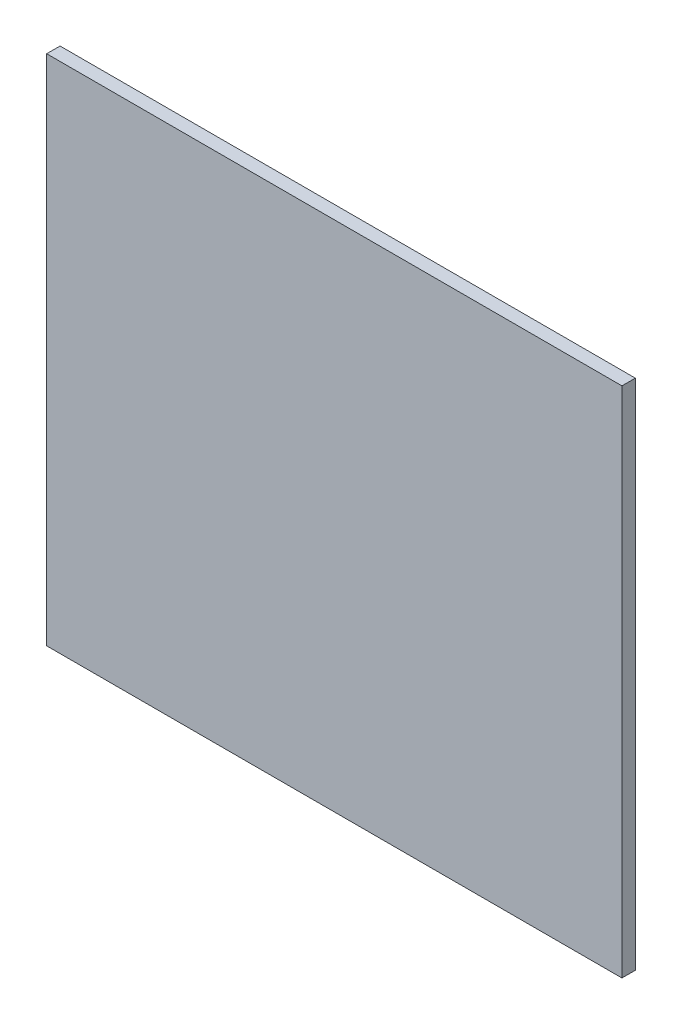
ISO-10303-21;
HEADER;
FILE_DESCRIPTION(('STEP AP214'),'2;1');
FILE_NAME('part.step','',(''),(''),'','','');
FILE_SCHEMA(('AUTOMOTIVE_DESIGN { 1 0 10303 214 1 1 1 1 }'));
ENDSEC;
DATA;
#1=APPLICATION_CONTEXT('core data for automotive mechanical design processes');
#2=APPLICATION_PROTOCOL_DEFINITION('international standard','automotive_design',2000,#1);
#3=PRODUCT_CONTEXT('',#1,'mechanical');
#4=PRODUCT('Part','Part','',(#3));
#5=PRODUCT_RELATED_PRODUCT_CATEGORY('part','',(#4));
#6=PRODUCT_DEFINITION_FORMATION('','',#4);
#7=PRODUCT_DEFINITION_CONTEXT('part definition',#1,'design');
#8=PRODUCT_DEFINITION('design','',#6,#7);
#9=PRODUCT_DEFINITION_SHAPE('','',#8);
#10=(LENGTH_UNIT() NAMED_UNIT(*) SI_UNIT(.MILLI.,.METRE.));
#11=(NAMED_UNIT(*) PLANE_ANGLE_UNIT() SI_UNIT($,.RADIAN.));
#12=(NAMED_UNIT(*) SI_UNIT($,.STERADIAN.) SOLID_ANGLE_UNIT());
#13=UNCERTAINTY_MEASURE_WITH_UNIT(LENGTH_MEASURE(1.E-05),#10,'distance_accuracy_value','');
#14=(GEOMETRIC_REPRESENTATION_CONTEXT(3) GLOBAL_UNCERTAINTY_ASSIGNED_CONTEXT((#13)) GLOBAL_UNIT_ASSIGNED_CONTEXT((#10,
#11,#12)) REPRESENTATION_CONTEXT('',''));
#15=CARTESIAN_POINT('',(0.,0.,0.));
#16=DIRECTION('',(0.,0.,1.));
#17=DIRECTION('',(1.,0.,0.));
#18=AXIS2_PLACEMENT_3D('',#15,#16,#17);
#19=CARTESIAN_POINT('',(-258.,0.,6.));
#20=DIRECTION('',(0.,1.,0.));
#21=DIRECTION('',(0.,0.,1.));
#22=AXIS2_PLACEMENT_3D('',#19,#20,#21);
#23=PLANE('',#22);
#24=DIRECTION('',(1.,0.,0.));
#25=VECTOR('',#24,1.);
#26=CARTESIAN_POINT('',(-258.,0.,0.));
#27=LINE('',#26,#25);
#28=CARTESIAN_POINT('',(-258.,0.,0.));
#29=VERTEX_POINT('',#28);
#30=CARTESIAN_POINT('',(0.,0.,0.));
#31=VERTEX_POINT('',#30);
#32=EDGE_CURVE('E96',#29,#31,#27,.T.);
#33=ORIENTED_EDGE('',*,*,#32,.T.);
#34=DIRECTION('',(0.,0.,-1.));
#35=VECTOR('',#34,1.);
#36=CARTESIAN_POINT('',(0.,0.,6.));
#37=LINE('',#36,#35);
#38=CARTESIAN_POINT('',(0.,0.,6.));
#39=VERTEX_POINT('',#38);
#40=EDGE_CURVE('E11',#39,#31,#37,.T.);
#41=ORIENTED_EDGE('',*,*,#40,.F.);
#42=DIRECTION('',(1.,0.,0.));
#43=VECTOR('',#42,1.);
#44=CARTESIAN_POINT('',(-258.,0.,6.));
#45=LINE('',#44,#43);
#46=CARTESIAN_POINT('',(-258.,0.,6.));
#47=VERTEX_POINT('',#46);
#48=EDGE_CURVE('E84',#47,#39,#45,.T.);
#49=ORIENTED_EDGE('',*,*,#48,.F.);
#50=DIRECTION('',(0.,0.,-1.));
#51=VECTOR('',#50,1.);
#52=CARTESIAN_POINT('',(-258.,0.,6.));
#53=LINE('',#52,#51);
#54=EDGE_CURVE('E92',#47,#29,#53,.T.);
#55=ORIENTED_EDGE('',*,*,#54,.T.);
#56=EDGE_LOOP('',(#33,#41,#49,#55));
#57=FACE_BOUND('',#56,.T.);
#58=ADVANCED_FACE('F33',(#57),#23,.F.);
#59=CARTESIAN_POINT('',(0.,0.,6.));
#60=DIRECTION('',(-1.,0.,0.));
#61=DIRECTION('',(0.,0.,1.));
#62=AXIS2_PLACEMENT_3D('',#59,#60,#61);
#63=PLANE('',#62);
#64=DIRECTION('',(0.,1.,0.));
#65=VECTOR('',#64,1.);
#66=CARTESIAN_POINT('',(0.,0.,0.));
#67=LINE('',#66,#65);
#68=CARTESIAN_POINT('',(0.,230.,0.));
#69=VERTEX_POINT('',#68);
#70=EDGE_CURVE('E88',#31,#69,#67,.T.);
#71=ORIENTED_EDGE('',*,*,#70,.T.);
#72=DIRECTION('',(0.,0.,-1.));
#73=VECTOR('',#72,1.);
#74=CARTESIAN_POINT('',(0.,230.,6.));
#75=LINE('',#74,#73);
#76=CARTESIAN_POINT('',(0.,230.,6.));
#77=VERTEX_POINT('',#76);
#78=EDGE_CURVE('E41',#77,#69,#75,.T.);
#79=ORIENTED_EDGE('',*,*,#78,.F.);
#80=DIRECTION('',(0.,1.,0.));
#81=VECTOR('',#80,1.);
#82=CARTESIAN_POINT('',(0.,0.,6.));
#83=LINE('',#82,#81);
#84=EDGE_CURVE('E79',#39,#77,#83,.T.);
#85=ORIENTED_EDGE('',*,*,#84,.F.);
#86=ORIENTED_EDGE('',*,*,#40,.T.);
#87=EDGE_LOOP('',(#71,#79,#85,#86));
#88=FACE_BOUND('',#87,.T.);
#89=ADVANCED_FACE('F87',(#88),#63,.F.);
#90=CARTESIAN_POINT('',(0.,230.,6.));
#91=DIRECTION('',(0.,-1.,0.));
#92=DIRECTION('',(0.,0.,-1.));
#93=AXIS2_PLACEMENT_3D('',#90,#91,#92);
#94=PLANE('',#93);
#95=DIRECTION('',(-1.,0.,0.));
#96=VECTOR('',#95,1.);
#97=CARTESIAN_POINT('',(0.,230.,0.));
#98=LINE('',#97,#96);
#99=CARTESIAN_POINT('',(-258.,230.,0.));
#100=VERTEX_POINT('',#99);
#101=EDGE_CURVE('E66',#69,#100,#98,.T.);
#102=ORIENTED_EDGE('',*,*,#101,.T.);
#103=DIRECTION('',(0.,0.,-1.));
#104=VECTOR('',#103,1.);
#105=CARTESIAN_POINT('',(-258.,230.,6.));
#106=LINE('',#105,#104);
#107=CARTESIAN_POINT('',(-258.,230.,6.));
#108=VERTEX_POINT('',#107);
#109=EDGE_CURVE('E89',#108,#100,#106,.T.);
#110=ORIENTED_EDGE('',*,*,#109,.F.);
#111=DIRECTION('',(-1.,0.,0.));
#112=VECTOR('',#111,1.);
#113=CARTESIAN_POINT('',(0.,230.,6.));
#114=LINE('',#113,#112);
#115=EDGE_CURVE('E82',#77,#108,#114,.T.);
#116=ORIENTED_EDGE('',*,*,#115,.F.);
#117=ORIENTED_EDGE('',*,*,#78,.T.);
#118=EDGE_LOOP('',(#102,#110,#116,#117));
#119=FACE_BOUND('',#118,.T.);
#120=ADVANCED_FACE('F90',(#119),#94,.F.);
#121=CARTESIAN_POINT('',(-258.,230.,6.));
#122=DIRECTION('',(1.,0.,0.));
#123=DIRECTION('',(0.,1.,0.));
#124=AXIS2_PLACEMENT_3D('',#121,#122,#123);
#125=PLANE('',#124);
#126=DIRECTION('',(0.,-1.,0.));
#127=VECTOR('',#126,1.);
#128=CARTESIAN_POINT('',(-258.,230.,0.));
#129=LINE('',#128,#127);
#130=EDGE_CURVE('E72',#100,#29,#129,.T.);
#131=ORIENTED_EDGE('',*,*,#130,.T.);
#132=ORIENTED_EDGE('',*,*,#54,.F.);
#133=DIRECTION('',(0.,-1.,0.));
#134=VECTOR('',#133,1.);
#135=CARTESIAN_POINT('',(-258.,230.,6.));
#136=LINE('',#135,#134);
#137=EDGE_CURVE('E49',#108,#47,#136,.T.);
#138=ORIENTED_EDGE('',*,*,#137,.F.);
#139=ORIENTED_EDGE('',*,*,#109,.T.);
#140=EDGE_LOOP('',(#131,#132,#138,#139));
#141=FACE_BOUND('',#140,.T.);
#142=ADVANCED_FACE('F103',(#141),#125,.F.);
#143=CARTESIAN_POINT('',(0.,0.,6.));
#144=DIRECTION('',(0.,0.,1.));
#145=DIRECTION('',(1.,0.,0.));
#146=AXIS2_PLACEMENT_3D('',#143,#144,#145);
#147=PLANE('',#146);
#148=ORIENTED_EDGE('',*,*,#48,.T.);
#149=ORIENTED_EDGE('',*,*,#84,.T.);
#150=ORIENTED_EDGE('',*,*,#115,.T.);
#151=ORIENTED_EDGE('',*,*,#137,.T.);
#152=EDGE_LOOP('',(#148,#149,#150,#151));
#153=FACE_BOUND('',#152,.T.);
#154=ADVANCED_FACE('F80',(#153),#147,.T.);
#155=CARTESIAN_POINT('',(0.,0.,0.));
#156=DIRECTION('',(0.,0.,1.));
#157=DIRECTION('',(1.,0.,0.));
#158=AXIS2_PLACEMENT_3D('',#155,#156,#157);
#159=PLANE('',#158);
#160=ORIENTED_EDGE('',*,*,#32,.F.);
#161=ORIENTED_EDGE('',*,*,#130,.F.);
#162=ORIENTED_EDGE('',*,*,#101,.F.);
#163=ORIENTED_EDGE('',*,*,#70,.F.);
#164=EDGE_LOOP('',(#160,#161,#162,#163));
#165=FACE_BOUND('',#164,.T.);
#166=ADVANCED_FACE('F106',(#165),#159,.F.);
#167=CLOSED_SHELL('',(#58,#89,#120,#142,#154,#166));
#168=MANIFOLD_SOLID_BREP('B2',#167);
#169=ADVANCED_BREP_SHAPE_REPRESENTATION('',(#18,#168),#14);
#170=SHAPE_DEFINITION_REPRESENTATION(#9,#169);
ENDSEC;
END-ISO-10303-21;
